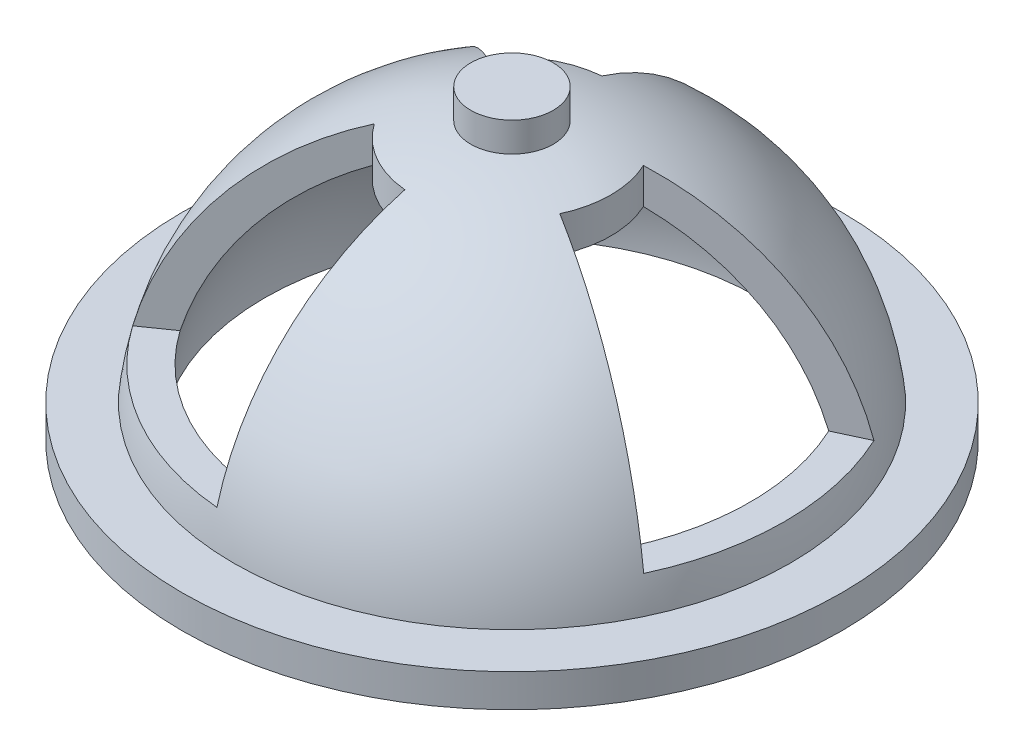
ISO-10303-21;
HEADER;
FILE_DESCRIPTION(('STEP AP214'),'2;1');
FILE_NAME('part.step','',(''),(''),'','','');
FILE_SCHEMA(('AUTOMOTIVE_DESIGN { 1 0 10303 214 1 1 1 1 }'));
ENDSEC;
DATA;
#1=APPLICATION_CONTEXT('core data for automotive mechanical design processes');
#2=APPLICATION_PROTOCOL_DEFINITION('international standard','automotive_design',2000,#1);
#3=PRODUCT_CONTEXT('',#1,'mechanical');
#4=PRODUCT('Part','Part','',(#3));
#5=PRODUCT_RELATED_PRODUCT_CATEGORY('part','',(#4));
#6=PRODUCT_DEFINITION_FORMATION('','',#4);
#7=PRODUCT_DEFINITION_CONTEXT('part definition',#1,'design');
#8=PRODUCT_DEFINITION('design','',#6,#7);
#9=PRODUCT_DEFINITION_SHAPE('','',#8);
#10=(LENGTH_UNIT() NAMED_UNIT(*) SI_UNIT(.MILLI.,.METRE.));
#11=(NAMED_UNIT(*) PLANE_ANGLE_UNIT() SI_UNIT($,.RADIAN.));
#12=(NAMED_UNIT(*) SI_UNIT($,.STERADIAN.) SOLID_ANGLE_UNIT());
#13=UNCERTAINTY_MEASURE_WITH_UNIT(LENGTH_MEASURE(1.E-05),#10,'distance_accuracy_value','');
#14=(GEOMETRIC_REPRESENTATION_CONTEXT(3) GLOBAL_UNCERTAINTY_ASSIGNED_CONTEXT((#13)) GLOBAL_UNIT_ASSIGNED_CONTEXT((#10,
#11,#12)) REPRESENTATION_CONTEXT('',''));
#15=CARTESIAN_POINT('',(0.,0.,0.));
#16=DIRECTION('',(0.,0.,1.));
#17=DIRECTION('',(1.,0.,0.));
#18=AXIS2_PLACEMENT_3D('',#15,#16,#17);
#19=CARTESIAN_POINT('',(0.,0.,0.));
#20=DIRECTION('',(0.,-1.,0.));
#21=DIRECTION('',(-1.,0.,0.));
#22=AXIS2_PLACEMENT_3D('',#19,#20,#21);
#23=SPHERICAL_SURFACE('',#22,37.5);
#24=CARTESIAN_POINT('',(0.,0.,0.));
#25=DIRECTION('',(-0.996194698091746,0.,0.087155742747648));
#26=DIRECTION('',(-0.087155742747648,0.,-0.996194698091746));
#27=AXIS2_PLACEMENT_3D('',#24,#25,#26);
#28=CIRCLE('',#27,37.5);
#29=CARTESIAN_POINT('',(-1.30733614121463,34.3693177121689,-14.9429204713761));
#30=VERTEX_POINT('',#29);
#31=CARTESIAN_POINT('',(-3.14998989107888,10.0000000000002,-36.0045492082056));
#32=VERTEX_POINT('',#31);
#33=EDGE_CURVE('E280',#30,#32,#28,.T.);
#34=ORIENTED_EDGE('',*,*,#33,.T.);
#35=CARTESIAN_POINT('',(0.,10.0000000000002,0.));
#36=DIRECTION('',(0.,1.,0.));
#37=DIRECTION('',(0.866025403784443,0.,-0.499999999999992));
#38=AXIS2_PLACEMENT_3D('',#35,#36,#37);
#39=CIRCLE('',#38,36.1420807370024);
#40=CARTESIAN_POINT('',(-29.6058593205731,10.0000000000003,-20.7302458714419));
#41=VERTEX_POINT('',#40);
#42=EDGE_CURVE('E153',#32,#41,#39,.T.);
#43=ORIENTED_EDGE('',*,*,#42,.T.);
#44=CARTESIAN_POINT('',(0.,0.,0.));
#45=DIRECTION('',(-0.573576436351053,0.,0.819152044288987));
#46=DIRECTION('',(-0.819152044288987,0.,-0.573576436351053));
#47=AXIS2_PLACEMENT_3D('',#44,#45,#46);
#48=CIRCLE('',#47,37.5);
#49=CARTESIAN_POINT('',(-12.2872806643347,34.3693177121689,-8.60364654526573));
#50=VERTEX_POINT('',#49);
#51=EDGE_CURVE('E140',#50,#41,#48,.T.);
#52=ORIENTED_EDGE('',*,*,#51,.F.);
#53=CARTESIAN_POINT('',(0.,34.3693177121689,0.));
#54=DIRECTION('',(0.,1.,0.));
#55=DIRECTION('',(0.866025403784443,0.,-0.499999999999992));
#56=AXIS2_PLACEMENT_3D('',#53,#54,#55);
#57=CIRCLE('',#56,15.);
#58=EDGE_CURVE('E137',#30,#50,#57,.T.);
#59=ORIENTED_EDGE('',*,*,#58,.F.);
#60=EDGE_LOOP('',(#34,#43,#52,#59));
#61=FACE_BOUND('',#60,.T.);
#62=CARTESIAN_POINT('',(0.,0.,0.));
#63=DIRECTION('',(0.573576436351042,0.,0.819152044288995));
#64=DIRECTION('',(-0.819152044288995,0.,0.573576436351042));
#65=AXIS2_PLACEMENT_3D('',#62,#63,#64);
#66=CIRCLE('',#65,37.5);
#67=CARTESIAN_POINT('',(-12.2872806643348,34.3693177121689,8.60364654526557));
#68=VERTEX_POINT('',#67);
#69=CARTESIAN_POINT('',(-29.6058593205734,10.0000000000003,20.7302458714414));
#70=VERTEX_POINT('',#69);
#71=EDGE_CURVE('E172',#68,#70,#66,.T.);
#72=ORIENTED_EDGE('',*,*,#71,.T.);
#73=CARTESIAN_POINT('',(0.,10.0000000000002,0.));
#74=DIRECTION('',(0.,1.,0.));
#75=DIRECTION('',(-0.866025403784436,0.,-0.500000000000004));
#76=AXIS2_PLACEMENT_3D('',#73,#74,#75);
#77=CIRCLE('',#76,36.1420807370024);
#78=CARTESIAN_POINT('',(-3.14998989107938,10.0000000000002,36.0045492082056));
#79=VERTEX_POINT('',#78);
#80=EDGE_CURVE('E184',#70,#79,#77,.T.);
#81=ORIENTED_EDGE('',*,*,#80,.T.);
#82=CARTESIAN_POINT('',(0.,0.,0.));
#83=DIRECTION('',(0.996194698091745,0.,0.0871557427476619));
#84=DIRECTION('',(-0.0871557427476619,0.,0.996194698091745));
#85=AXIS2_PLACEMENT_3D('',#82,#83,#84);
#86=CIRCLE('',#85,37.5);
#87=CARTESIAN_POINT('',(-1.30733614121483,34.3693177121688,14.9429204713761));
#88=VERTEX_POINT('',#87);
#89=EDGE_CURVE('E159',#88,#79,#86,.T.);
#90=ORIENTED_EDGE('',*,*,#89,.F.);
#91=CARTESIAN_POINT('',(0.,34.3693177121689,0.));
#92=DIRECTION('',(0.,1.,0.));
#93=DIRECTION('',(-0.866025403784436,0.,-0.500000000000004));
#94=AXIS2_PLACEMENT_3D('',#91,#92,#93);
#95=CIRCLE('',#94,15.);
#96=EDGE_CURVE('E188',#68,#88,#95,.T.);
#97=ORIENTED_EDGE('',*,*,#96,.F.);
#98=EDGE_LOOP('',(#72,#81,#90,#97));
#99=FACE_BOUND('',#98,.T.);
#100=CARTESIAN_POINT('',(0.,0.,0.));
#101=DIRECTION('',(0.4226182617407,0.,-0.90630778703665));
#102=DIRECTION('',(0.90630778703665,0.,0.4226182617407));
#103=AXIS2_PLACEMENT_3D('',#100,#101,#102);
#104=CIRCLE('',#103,37.5);
#105=CARTESIAN_POINT('',(13.5946168055497,34.3693177121689,6.33927392611051));
#106=VERTEX_POINT('',#105);
#107=CARTESIAN_POINT('',(32.7558492116526,10.0000000000002,15.274303336764));
#108=VERTEX_POINT('',#107);
#109=EDGE_CURVE('E215',#106,#108,#104,.T.);
#110=ORIENTED_EDGE('',*,*,#109,.T.);
#111=CARTESIAN_POINT('',(0.,10.0000000000002,0.));
#112=DIRECTION('',(0.,1.,0.));
#113=DIRECTION('',(0.,0.,1.));
#114=AXIS2_PLACEMENT_3D('',#111,#112,#113);
#115=CIRCLE('',#114,36.1420807370024);
#116=CARTESIAN_POINT('',(32.7558492116526,10.0000000000002,-15.274303336764));
#117=VERTEX_POINT('',#116);
#118=EDGE_CURVE('E227',#108,#117,#115,.T.);
#119=ORIENTED_EDGE('',*,*,#118,.T.);
#120=CARTESIAN_POINT('',(0.,0.,0.));
#121=DIRECTION('',(-0.4226182617407,0.,-0.90630778703665));
#122=DIRECTION('',(0.90630778703665,0.,-0.4226182617407));
#123=AXIS2_PLACEMENT_3D('',#120,#121,#122);
#124=CIRCLE('',#123,37.5);
#125=CARTESIAN_POINT('',(13.5946168055497,34.3693177121688,-6.3392739261105));
#126=VERTEX_POINT('',#125);
#127=EDGE_CURVE('E202',#126,#117,#124,.T.);
#128=ORIENTED_EDGE('',*,*,#127,.F.);
#129=CARTESIAN_POINT('',(0.,34.3693177121689,0.));
#130=DIRECTION('',(0.,1.,0.));
#131=DIRECTION('',(0.,0.,1.));
#132=AXIS2_PLACEMENT_3D('',#129,#130,#131);
#133=CIRCLE('',#132,15.);
#134=EDGE_CURVE('E231',#106,#126,#133,.T.);
#135=ORIENTED_EDGE('',*,*,#134,.F.);
#136=EDGE_LOOP('',(#110,#119,#128,#135));
#137=FACE_BOUND('',#136,.T.);
#138=CARTESIAN_POINT('',(0.,0.,0.));
#139=DIRECTION('',(0.,-1.,0.));
#140=DIRECTION('',(1.,0.,0.));
#141=AXIS2_PLACEMENT_3D('',#138,#139,#140);
#142=CIRCLE('',#141,37.5000000000001);
#143=CARTESIAN_POINT('',(37.5,0.,0.));
#144=VERTEX_POINT('',#143);
#145=EDGE_CURVE('E239',#144,#144,#142,.T.);
#146=ORIENTED_EDGE('',*,*,#145,.T.);
#147=EDGE_LOOP('',(#146));
#148=FACE_BOUND('',#147,.T.);
#149=ADVANCED_FACE('F39',(#61,#99,#137,#148),#23,.F.);
#150=CARTESIAN_POINT('',(0.,46.5,0.));
#151=DIRECTION('',(0.,1.,0.));
#152=DIRECTION('',(-1.,0.,0.));
#153=AXIS2_PLACEMENT_3D('',#150,#151,#152);
#154=PLANE('',#153);
#155=CARTESIAN_POINT('',(0.,46.5,0.));
#156=DIRECTION('',(0.,-1.,0.));
#157=DIRECTION('',(1.,0.,0.));
#158=AXIS2_PLACEMENT_3D('',#155,#156,#157);
#159=CIRCLE('',#158,6.25);
#160=CARTESIAN_POINT('',(6.25,46.5,0.));
#161=VERTEX_POINT('',#160);
#162=EDGE_CURVE('E11',#161,#161,#159,.T.);
#163=ORIENTED_EDGE('',*,*,#162,.F.);
#164=EDGE_LOOP('',(#163));
#165=FACE_BOUND('',#164,.T.);
#166=ADVANCED_FACE('F262',(#165),#154,.T.);
#167=CARTESIAN_POINT('',(0.,37.5,0.));
#168=DIRECTION('',(0.,-1.,0.));
#169=DIRECTION('',(1.,0.,0.));
#170=AXIS2_PLACEMENT_3D('',#167,#168,#169);
#171=CYLINDRICAL_SURFACE('',#170,6.25);
#172=ORIENTED_EDGE('',*,*,#162,.T.);
#173=EDGE_LOOP('',(#172));
#174=FACE_BOUND('',#173,.T.);
#175=CARTESIAN_POINT('',(0.,42.0379293020006,0.));
#176=DIRECTION('',(0.,-1.,0.));
#177=DIRECTION('',(1.,0.,0.));
#178=AXIS2_PLACEMENT_3D('',#175,#176,#177);
#179=CIRCLE('',#178,6.25000000000001);
#180=CARTESIAN_POINT('',(6.25,42.0379293020006,0.));
#181=VERTEX_POINT('',#180);
#182=EDGE_CURVE('E47',#181,#181,#179,.T.);
#183=ORIENTED_EDGE('',*,*,#182,.F.);
#184=EDGE_LOOP('',(#183));
#185=FACE_BOUND('',#184,.T.);
#186=ADVANCED_FACE('F260',(#174,#185),#171,.T.);
#187=CARTESIAN_POINT('',(0.,0.,0.));
#188=DIRECTION('',(0.,-1.,0.));
#189=DIRECTION('',(1.,0.,0.));
#190=AXIS2_PLACEMENT_3D('',#187,#188,#189);
#191=SPHERICAL_SURFACE('',#190,42.5);
#192=CARTESIAN_POINT('',(0.,0.,0.));
#193=DIRECTION('',(0.996194698091746,0.,-0.087155742747648));
#194=DIRECTION('',(-0.087155742747648,0.,-0.996194698091746));
#195=AXIS2_PLACEMENT_3D('',#192,#193,#194);
#196=CIRCLE('',#195,42.5);
#197=CARTESIAN_POINT('',(-3.6001230133784,10.0000000000003,-41.149594339295));
#198=VERTEX_POINT('',#197);
#199=CARTESIAN_POINT('',(-1.30733614121461,39.7649343014672,-14.9429204713761));
#200=VERTEX_POINT('',#199);
#201=EDGE_CURVE('E145',#198,#200,#196,.T.);
#202=ORIENTED_EDGE('',*,*,#201,.T.);
#203=CARTESIAN_POINT('',(1.08871840223068E-13,39.7649343014672,0.));
#204=DIRECTION('',(0.,1.,0.));
#205=DIRECTION('',(0.866025403784443,0.,-0.499999999999992));
#206=AXIS2_PLACEMENT_3D('',#203,#204,#205);
#207=CIRCLE('',#206,15.);
#208=CARTESIAN_POINT('',(-12.2872806643347,39.7649343014672,-8.60364654526573));
#209=VERTEX_POINT('',#208);
#210=EDGE_CURVE('E134',#200,#209,#207,.T.);
#211=ORIENTED_EDGE('',*,*,#210,.T.);
#212=CARTESIAN_POINT('',(0.,0.,0.));
#213=DIRECTION('',(0.573576436351053,0.,-0.819152044288987));
#214=DIRECTION('',(-0.819152044288987,0.,-0.573576436351053));
#215=AXIS2_PLACEMENT_3D('',#212,#213,#214);
#216=CIRCLE('',#215,42.5);
#217=CARTESIAN_POINT('',(-33.8365325465641,10.0000000000003,-23.6925951559828));
#218=VERTEX_POINT('',#217);
#219=EDGE_CURVE('E125',#218,#209,#216,.T.);
#220=ORIENTED_EDGE('',*,*,#219,.F.);
#221=CARTESIAN_POINT('',(0.,10.0000000000002,0.));
#222=DIRECTION('',(0.,1.,0.));
#223=DIRECTION('',(0.866025403784443,0.,-0.499999999999992));
#224=AXIS2_PLACEMENT_3D('',#221,#222,#223);
#225=CIRCLE('',#224,41.3067791046457);
#226=EDGE_CURVE('E455',#198,#218,#225,.T.);
#227=ORIENTED_EDGE('',*,*,#226,.F.);
#228=EDGE_LOOP('',(#202,#211,#220,#227));
#229=FACE_BOUND('',#228,.T.);
#230=CARTESIAN_POINT('',(0.,0.,0.));
#231=DIRECTION('',(-0.573576436351042,0.,-0.819152044288995));
#232=DIRECTION('',(-0.819152044288995,0.,0.573576436351042));
#233=AXIS2_PLACEMENT_3D('',#230,#231,#232);
#234=CIRCLE('',#233,42.5);
#235=CARTESIAN_POINT('',(-33.8365325465645,10.0000000000003,23.6925951559824));
#236=VERTEX_POINT('',#235);
#237=CARTESIAN_POINT('',(-12.2872806643348,39.7649343014672,8.60364654526556));
#238=VERTEX_POINT('',#237);
#239=EDGE_CURVE('E165',#236,#238,#234,.T.);
#240=ORIENTED_EDGE('',*,*,#239,.T.);
#241=CARTESIAN_POINT('',(1.08871840223069E-13,39.7649343014672,0.));
#242=DIRECTION('',(0.,1.,0.));
#243=DIRECTION('',(-0.866025403784436,0.,-0.500000000000004));
#244=AXIS2_PLACEMENT_3D('',#241,#242,#243);
#245=CIRCLE('',#244,15.);
#246=CARTESIAN_POINT('',(-1.30733614121482,39.7649343014672,14.9429204713761));
#247=VERTEX_POINT('',#246);
#248=EDGE_CURVE('E192',#238,#247,#245,.T.);
#249=ORIENTED_EDGE('',*,*,#248,.T.);
#250=CARTESIAN_POINT('',(0.,0.,0.));
#251=DIRECTION('',(-0.996194698091745,0.,-0.0871557427476619));
#252=DIRECTION('',(-0.0871557427476619,0.,0.996194698091745));
#253=AXIS2_PLACEMENT_3D('',#250,#251,#252);
#254=CIRCLE('',#253,42.5);
#255=CARTESIAN_POINT('',(-3.60012301337897,10.0000000000002,41.1495943392949));
#256=VERTEX_POINT('',#255);
#257=EDGE_CURVE('E147',#256,#247,#254,.T.);
#258=ORIENTED_EDGE('',*,*,#257,.F.);
#259=CARTESIAN_POINT('',(0.,10.0000000000002,0.));
#260=DIRECTION('',(0.,1.,0.));
#261=DIRECTION('',(-0.866025403784436,0.,-0.500000000000004));
#262=AXIS2_PLACEMENT_3D('',#259,#260,#261);
#263=CIRCLE('',#262,41.3067791046457);
#264=EDGE_CURVE('E180',#236,#256,#263,.T.);
#265=ORIENTED_EDGE('',*,*,#264,.F.);
#266=EDGE_LOOP('',(#240,#249,#258,#265));
#267=FACE_BOUND('',#266,.T.);
#268=CARTESIAN_POINT('',(0.,0.,0.));
#269=DIRECTION('',(-0.4226182617407,0.,0.90630778703665));
#270=DIRECTION('',(0.90630778703665,0.,0.4226182617407));
#271=AXIS2_PLACEMENT_3D('',#268,#269,#270);
#272=CIRCLE('',#271,42.5);
#273=CARTESIAN_POINT('',(37.4366555599432,10.0000000000002,17.4569991833125));
#274=VERTEX_POINT('',#273);
#275=CARTESIAN_POINT('',(13.5946168055497,39.7649343014672,6.33927392611051));
#276=VERTEX_POINT('',#275);
#277=EDGE_CURVE('E208',#274,#276,#272,.T.);
#278=ORIENTED_EDGE('',*,*,#277,.T.);
#279=CARTESIAN_POINT('',(0.,39.7649343014672,0.));
#280=DIRECTION('',(0.,1.,0.));
#281=DIRECTION('',(0.,0.,1.));
#282=AXIS2_PLACEMENT_3D('',#279,#280,#281);
#283=CIRCLE('',#282,15.);
#284=CARTESIAN_POINT('',(13.5946168055497,39.7649343014672,-6.3392739261105));
#285=VERTEX_POINT('',#284);
#286=EDGE_CURVE('E235',#276,#285,#283,.T.);
#287=ORIENTED_EDGE('',*,*,#286,.T.);
#288=CARTESIAN_POINT('',(0.,0.,0.));
#289=DIRECTION('',(0.4226182617407,0.,0.90630778703665));
#290=DIRECTION('',(0.90630778703665,0.,-0.4226182617407));
#291=AXIS2_PLACEMENT_3D('',#288,#289,#290);
#292=CIRCLE('',#291,42.5);
#293=CARTESIAN_POINT('',(37.4366555599432,10.0000000000002,-17.4569991833125));
#294=VERTEX_POINT('',#293);
#295=EDGE_CURVE('E196',#294,#285,#292,.T.);
#296=ORIENTED_EDGE('',*,*,#295,.F.);
#297=CARTESIAN_POINT('',(0.,10.0000000000002,0.));
#298=DIRECTION('',(0.,1.,0.));
#299=DIRECTION('',(0.,0.,1.));
#300=AXIS2_PLACEMENT_3D('',#297,#298,#299);
#301=CIRCLE('',#300,41.3067791046457);
#302=EDGE_CURVE('E223',#274,#294,#301,.T.);
#303=ORIENTED_EDGE('',*,*,#302,.F.);
#304=EDGE_LOOP('',(#278,#287,#296,#303));
#305=FACE_BOUND('',#304,.T.);
#306=ORIENTED_EDGE('',*,*,#182,.T.);
#307=EDGE_LOOP('',(#306));
#308=FACE_BOUND('',#307,.T.);
#309=CARTESIAN_POINT('',(0.,5.00000000000007,0.));
#310=DIRECTION('',(0.,-1.,0.));
#311=DIRECTION('',(1.,0.,0.));
#312=AXIS2_PLACEMENT_3D('',#309,#310,#311);
#313=CIRCLE('',#312,42.2048575403354);
#314=CARTESIAN_POINT('',(42.2048575403353,5.,0.));
#315=VERTEX_POINT('',#314);
#316=EDGE_CURVE('E251',#315,#315,#313,.T.);
#317=ORIENTED_EDGE('',*,*,#316,.F.);
#318=EDGE_LOOP('',(#317));
#319=FACE_BOUND('',#318,.T.);
#320=ADVANCED_FACE('F143',(#229,#267,#305,#308,#319),#191,.T.);
#321=CARTESIAN_POINT('',(42.2048575403353,5.00000000000001,0.));
#322=DIRECTION('',(0.,1.,0.));
#323=DIRECTION('',(-1.,0.,0.));
#324=AXIS2_PLACEMENT_3D('',#321,#322,#323);
#325=PLANE('',#324);
#326=ORIENTED_EDGE('',*,*,#316,.T.);
#327=EDGE_LOOP('',(#326));
#328=FACE_BOUND('',#327,.T.);
#329=CARTESIAN_POINT('',(0.,5.00000000000009,0.));
#330=DIRECTION('',(0.,-1.,0.));
#331=DIRECTION('',(1.,0.,0.));
#332=AXIS2_PLACEMENT_3D('',#329,#330,#331);
#333=CIRCLE('',#332,50.0000000000001);
#334=CARTESIAN_POINT('',(50.,5.,0.));
#335=VERTEX_POINT('',#334);
#336=EDGE_CURVE('E247',#335,#335,#333,.T.);
#337=ORIENTED_EDGE('',*,*,#336,.F.);
#338=EDGE_LOOP('',(#337));
#339=FACE_BOUND('',#338,.T.);
#340=ADVANCED_FACE('F269',(#328,#339),#325,.T.);
#341=CARTESIAN_POINT('',(0.,37.5,0.));
#342=DIRECTION('',(0.,-1.,0.));
#343=DIRECTION('',(1.,0.,0.));
#344=AXIS2_PLACEMENT_3D('',#341,#342,#343);
#345=CYLINDRICAL_SURFACE('',#344,50.0000000000001);
#346=ORIENTED_EDGE('',*,*,#336,.T.);
#347=EDGE_LOOP('',(#346));
#348=FACE_BOUND('',#347,.T.);
#349=CARTESIAN_POINT('',(0.,0.,0.));
#350=DIRECTION('',(0.,-1.,0.));
#351=DIRECTION('',(1.,0.,0.));
#352=AXIS2_PLACEMENT_3D('',#349,#350,#351);
#353=CIRCLE('',#352,50.0000000000001);
#354=CARTESIAN_POINT('',(50.,0.,0.));
#355=VERTEX_POINT('',#354);
#356=EDGE_CURVE('E243',#355,#355,#353,.T.);
#357=ORIENTED_EDGE('',*,*,#356,.F.);
#358=EDGE_LOOP('',(#357));
#359=FACE_BOUND('',#358,.T.);
#360=ADVANCED_FACE('F292',(#348,#359),#345,.T.);
#361=CARTESIAN_POINT('',(50.,0.,0.));
#362=DIRECTION('',(0.,-1.,0.));
#363=DIRECTION('',(1.,0.,0.));
#364=AXIS2_PLACEMENT_3D('',#361,#362,#363);
#365=PLANE('',#364);
#366=ORIENTED_EDGE('',*,*,#356,.T.);
#367=EDGE_LOOP('',(#366));
#368=FACE_BOUND('',#367,.T.);
#369=ORIENTED_EDGE('',*,*,#145,.F.);
#370=EDGE_LOOP('',(#369));
#371=FACE_BOUND('',#370,.T.);
#372=ADVANCED_FACE('F289',(#368,#371),#365,.T.);
#373=CARTESIAN_POINT('',(0.,61.6746720965431,0.));
#374=DIRECTION('',(0.,1.,0.));
#375=DIRECTION('',(0.,0.,1.));
#376=AXIS2_PLACEMENT_3D('',#373,#374,#375);
#377=CYLINDRICAL_SURFACE('',#376,15.);
#378=ORIENTED_EDGE('',*,*,#134,.T.);
#379=DIRECTION('',(0.,-1.,0.));
#380=VECTOR('',#379,1.);
#381=CARTESIAN_POINT('',(13.5946168055497,39.7649343014672,-6.3392739261105));
#382=LINE('',#381,#380);
#383=EDGE_CURVE('E199',#285,#126,#382,.T.);
#384=ORIENTED_EDGE('',*,*,#383,.F.);
#385=ORIENTED_EDGE('',*,*,#286,.F.);
#386=DIRECTION('',(0.,-1.,0.));
#387=VECTOR('',#386,1.);
#388=CARTESIAN_POINT('',(13.5946168055497,39.7649343014672,6.33927392611051));
#389=LINE('',#388,#387);
#390=EDGE_CURVE('E212',#276,#106,#389,.T.);
#391=ORIENTED_EDGE('',*,*,#390,.T.);
#392=EDGE_LOOP('',(#378,#384,#385,#391));
#393=FACE_BOUND('',#392,.T.);
#394=ADVANCED_FACE('F291',(#393),#377,.T.);
#395=CARTESIAN_POINT('',(37.4366555599432,10.0000000000002,17.4569991833125));
#396=DIRECTION('',(0.,1.,0.));
#397=DIRECTION('',(0.,0.,1.));
#398=AXIS2_PLACEMENT_3D('',#395,#396,#397);
#399=PLANE('',#398);
#400=DIRECTION('',(0.90630778703665,0.,0.4226182617407));
#401=VECTOR('',#400,1.);
#402=CARTESIAN_POINT('',(37.4366555599432,10.0000000000002,17.4569991833125));
#403=LINE('',#402,#401);
#404=EDGE_CURVE('E219',#108,#274,#403,.T.);
#405=ORIENTED_EDGE('',*,*,#404,.T.);
#406=ORIENTED_EDGE('',*,*,#302,.T.);
#407=DIRECTION('',(0.90630778703665,0.,-0.4226182617407));
#408=VECTOR('',#407,1.);
#409=CARTESIAN_POINT('',(37.4366555599432,10.0000000000002,-17.4569991833125));
#410=LINE('',#409,#408);
#411=EDGE_CURVE('E205',#117,#294,#410,.T.);
#412=ORIENTED_EDGE('',*,*,#411,.F.);
#413=ORIENTED_EDGE('',*,*,#118,.F.);
#414=EDGE_LOOP('',(#405,#406,#412,#413));
#415=FACE_BOUND('',#414,.T.);
#416=ADVANCED_FACE('F299',(#415),#399,.T.);
#417=CARTESIAN_POINT('',(0.,0.,0.));
#418=DIRECTION('',(-0.4226182617407,0.,0.90630778703665));
#419=DIRECTION('',(0.90630778703665,0.,0.4226182617407));
#420=AXIS2_PLACEMENT_3D('',#417,#418,#419);
#421=PLANE('',#420);
#422=ORIENTED_EDGE('',*,*,#277,.F.);
#423=ORIENTED_EDGE('',*,*,#404,.F.);
#424=ORIENTED_EDGE('',*,*,#109,.F.);
#425=ORIENTED_EDGE('',*,*,#390,.F.);
#426=EDGE_LOOP('',(#422,#423,#424,#425));
#427=FACE_BOUND('',#426,.T.);
#428=ADVANCED_FACE('F340',(#427),#421,.F.);
#429=CARTESIAN_POINT('',(0.,0.,0.));
#430=DIRECTION('',(0.4226182617407,0.,0.90630778703665));
#431=DIRECTION('',(0.90630778703665,0.,-0.4226182617407));
#432=AXIS2_PLACEMENT_3D('',#429,#430,#431);
#433=PLANE('',#432);
#434=ORIENTED_EDGE('',*,*,#295,.T.);
#435=ORIENTED_EDGE('',*,*,#383,.T.);
#436=ORIENTED_EDGE('',*,*,#127,.T.);
#437=ORIENTED_EDGE('',*,*,#411,.T.);
#438=EDGE_LOOP('',(#434,#435,#436,#437));
#439=FACE_BOUND('',#438,.T.);
#440=ADVANCED_FACE('F349',(#439),#433,.T.);
#441=CARTESIAN_POINT('',(1.68858195398987E-13,61.6746720965431,0.));
#442=DIRECTION('',(0.,1.,0.));
#443=DIRECTION('',(-0.866025403784436,0.,-0.500000000000004));
#444=AXIS2_PLACEMENT_3D('',#441,#442,#443);
#445=CYLINDRICAL_SURFACE('',#444,15.);
#446=ORIENTED_EDGE('',*,*,#96,.T.);
#447=DIRECTION('',(0.,-1.,0.));
#448=VECTOR('',#447,1.);
#449=CARTESIAN_POINT('',(-1.30733614121482,39.7649343014672,14.9429204713761));
#450=LINE('',#449,#448);
#451=EDGE_CURVE('E151',#247,#88,#450,.T.);
#452=ORIENTED_EDGE('',*,*,#451,.F.);
#453=ORIENTED_EDGE('',*,*,#248,.F.);
#454=DIRECTION('',(0.,-1.,0.));
#455=VECTOR('',#454,1.);
#456=CARTESIAN_POINT('',(-12.2872806643348,39.7649343014672,8.60364654526556));
#457=LINE('',#456,#455);
#458=EDGE_CURVE('E169',#238,#68,#457,.T.);
#459=ORIENTED_EDGE('',*,*,#458,.T.);
#460=EDGE_LOOP('',(#446,#452,#453,#459));
#461=FACE_BOUND('',#460,.T.);
#462=ADVANCED_FACE('F358',(#461),#445,.T.);
#463=CARTESIAN_POINT('',(-33.8365325465645,10.0000000000003,23.6925951559824));
#464=DIRECTION('',(0.,1.,0.));
#465=DIRECTION('',(-0.866025403784436,0.,-0.500000000000004));
#466=AXIS2_PLACEMENT_3D('',#463,#464,#465);
#467=PLANE('',#466);
#468=DIRECTION('',(-0.819152044288995,0.,0.573576436351042));
#469=VECTOR('',#468,1.);
#470=CARTESIAN_POINT('',(-33.8365325465645,10.0000000000003,23.6925951559824));
#471=LINE('',#470,#469);
#472=EDGE_CURVE('E176',#70,#236,#471,.T.);
#473=ORIENTED_EDGE('',*,*,#472,.T.);
#474=ORIENTED_EDGE('',*,*,#264,.T.);
#475=DIRECTION('',(-0.0871557427476619,0.,0.996194698091745));
#476=VECTOR('',#475,1.);
#477=CARTESIAN_POINT('',(-3.60012301337897,10.0000000000003,41.149594339295));
#478=LINE('',#477,#476);
#479=EDGE_CURVE('E162',#79,#256,#478,.T.);
#480=ORIENTED_EDGE('',*,*,#479,.F.);
#481=ORIENTED_EDGE('',*,*,#80,.F.);
#482=EDGE_LOOP('',(#473,#474,#480,#481));
#483=FACE_BOUND('',#482,.T.);
#484=ADVANCED_FACE('F379',(#483),#467,.T.);
#485=CARTESIAN_POINT('',(0.,0.,0.));
#486=DIRECTION('',(-0.573576436351042,0.,-0.819152044288995));
#487=DIRECTION('',(-0.819152044288995,0.,0.573576436351042));
#488=AXIS2_PLACEMENT_3D('',#485,#486,#487);
#489=PLANE('',#488);
#490=ORIENTED_EDGE('',*,*,#239,.F.);
#491=ORIENTED_EDGE('',*,*,#472,.F.);
#492=ORIENTED_EDGE('',*,*,#71,.F.);
#493=ORIENTED_EDGE('',*,*,#458,.F.);
#494=EDGE_LOOP('',(#490,#491,#492,#493));
#495=FACE_BOUND('',#494,.T.);
#496=ADVANCED_FACE('F389',(#495),#489,.F.);
#497=CARTESIAN_POINT('',(0.,0.,0.));
#498=DIRECTION('',(-0.996194698091745,0.,-0.0871557427476619));
#499=DIRECTION('',(-0.0871557427476619,0.,0.996194698091745));
#500=AXIS2_PLACEMENT_3D('',#497,#498,#499);
#501=PLANE('',#500);
#502=ORIENTED_EDGE('',*,*,#257,.T.);
#503=ORIENTED_EDGE('',*,*,#451,.T.);
#504=ORIENTED_EDGE('',*,*,#89,.T.);
#505=ORIENTED_EDGE('',*,*,#479,.T.);
#506=EDGE_LOOP('',(#502,#503,#504,#505));
#507=FACE_BOUND('',#506,.T.);
#508=ADVANCED_FACE('F399',(#507),#501,.T.);
#509=CARTESIAN_POINT('',(1.68858195398986E-13,61.6746720965431,0.));
#510=DIRECTION('',(0.,1.,0.));
#511=DIRECTION('',(0.866025403784443,0.,-0.499999999999992));
#512=AXIS2_PLACEMENT_3D('',#509,#510,#511);
#513=CYLINDRICAL_SURFACE('',#512,15.);
#514=ORIENTED_EDGE('',*,*,#58,.T.);
#515=DIRECTION('',(0.,-1.,0.));
#516=VECTOR('',#515,1.);
#517=CARTESIAN_POINT('',(-12.2872806643347,39.7649343014672,-8.60364654526573));
#518=LINE('',#517,#516);
#519=EDGE_CURVE('E54',#209,#50,#518,.T.);
#520=ORIENTED_EDGE('',*,*,#519,.F.);
#521=ORIENTED_EDGE('',*,*,#210,.F.);
#522=DIRECTION('',(0.,-1.,0.));
#523=VECTOR('',#522,1.);
#524=CARTESIAN_POINT('',(-1.30733614121461,39.7649343014672,-14.9429204713761));
#525=LINE('',#524,#523);
#526=EDGE_CURVE('E452',#200,#30,#525,.T.);
#527=ORIENTED_EDGE('',*,*,#526,.T.);
#528=EDGE_LOOP('',(#514,#520,#521,#527));
#529=FACE_BOUND('',#528,.T.);
#530=ADVANCED_FACE('F133',(#529),#513,.T.);
#531=CARTESIAN_POINT('',(-3.6001230133784,10.0000000000003,-41.149594339295));
#532=DIRECTION('',(0.,1.,0.));
#533=DIRECTION('',(0.866025403784443,0.,-0.499999999999992));
#534=AXIS2_PLACEMENT_3D('',#531,#532,#533);
#535=PLANE('',#534);
#536=DIRECTION('',(-0.087155742747648,0.,-0.996194698091746));
#537=VECTOR('',#536,1.);
#538=CARTESIAN_POINT('',(-3.6001230133784,10.0000000000003,-41.149594339295));
#539=LINE('',#538,#537);
#540=EDGE_CURVE('E451',#32,#198,#539,.T.);
#541=ORIENTED_EDGE('',*,*,#540,.T.);
#542=ORIENTED_EDGE('',*,*,#226,.T.);
#543=DIRECTION('',(-0.819152044288987,0.,-0.573576436351053));
#544=VECTOR('',#543,1.);
#545=CARTESIAN_POINT('',(-33.8365325465641,10.0000000000003,-23.6925951559828));
#546=LINE('',#545,#544);
#547=EDGE_CURVE('E59',#41,#218,#546,.T.);
#548=ORIENTED_EDGE('',*,*,#547,.F.);
#549=ORIENTED_EDGE('',*,*,#42,.F.);
#550=EDGE_LOOP('',(#541,#542,#548,#549));
#551=FACE_BOUND('',#550,.T.);
#552=ADVANCED_FACE('F418',(#551),#535,.T.);
#553=CARTESIAN_POINT('',(0.,0.,0.));
#554=DIRECTION('',(0.996194698091746,0.,-0.087155742747648));
#555=DIRECTION('',(-0.087155742747648,0.,-0.996194698091746));
#556=AXIS2_PLACEMENT_3D('',#553,#554,#555);
#557=PLANE('',#556);
#558=ORIENTED_EDGE('',*,*,#201,.F.);
#559=ORIENTED_EDGE('',*,*,#540,.F.);
#560=ORIENTED_EDGE('',*,*,#33,.F.);
#561=ORIENTED_EDGE('',*,*,#526,.F.);
#562=EDGE_LOOP('',(#558,#559,#560,#561));
#563=FACE_BOUND('',#562,.T.);
#564=ADVANCED_FACE('F427',(#563),#557,.F.);
#565=CARTESIAN_POINT('',(0.,0.,0.));
#566=DIRECTION('',(0.573576436351053,0.,-0.819152044288987));
#567=DIRECTION('',(-0.819152044288987,0.,-0.573576436351053));
#568=AXIS2_PLACEMENT_3D('',#565,#566,#567);
#569=PLANE('',#568);
#570=ORIENTED_EDGE('',*,*,#219,.T.);
#571=ORIENTED_EDGE('',*,*,#519,.T.);
#572=ORIENTED_EDGE('',*,*,#51,.T.);
#573=ORIENTED_EDGE('',*,*,#547,.T.);
#574=EDGE_LOOP('',(#570,#571,#572,#573));
#575=FACE_BOUND('',#574,.T.);
#576=ADVANCED_FACE('F126',(#575),#569,.T.);
#577=CLOSED_SHELL('',(#149,#166,#186,#320,#340,#360,#372,#394,#416,#428,#440,#462,#484,#496,
#508,#530,#552,#564,#576));
#578=MANIFOLD_SOLID_BREP('B2',#577);
#579=ADVANCED_BREP_SHAPE_REPRESENTATION('',(#18,#578),#14);
#580=SHAPE_DEFINITION_REPRESENTATION(#9,#579);
ENDSEC;
END-ISO-10303-21;
